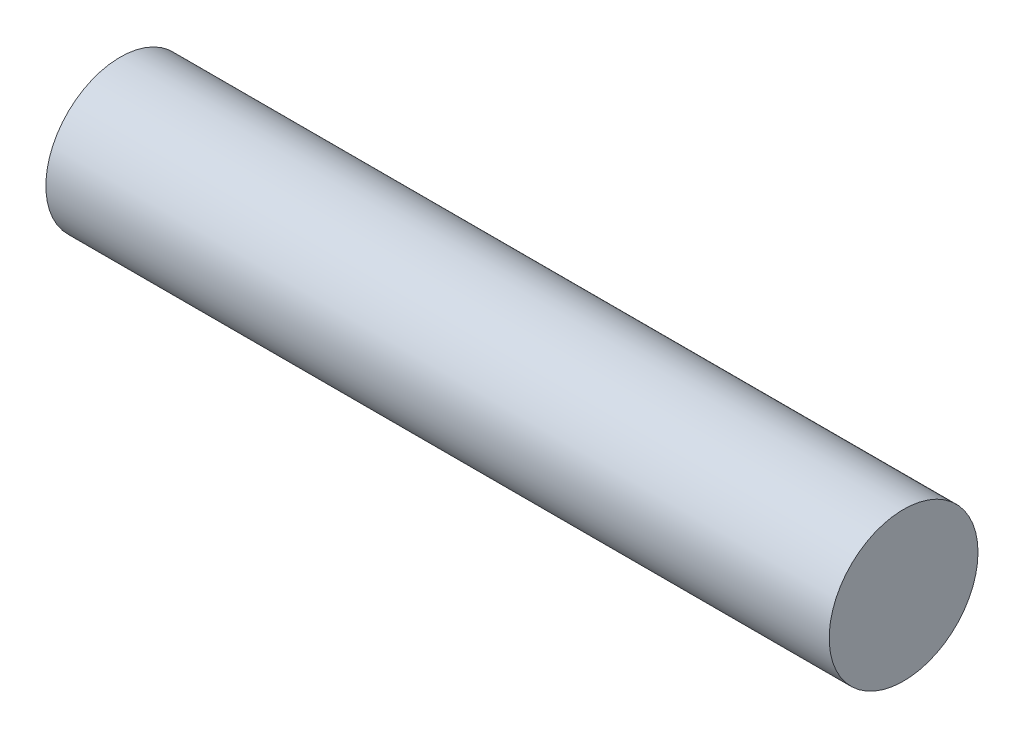
ISO-10303-21;
HEADER;
FILE_DESCRIPTION(('STEP AP214'),'2;1');
FILE_NAME('part.step','',(''),(''),'','','');
FILE_SCHEMA(('AUTOMOTIVE_DESIGN { 1 0 10303 214 1 1 1 1 }'));
ENDSEC;
DATA;
#1=APPLICATION_CONTEXT('core data for automotive mechanical design processes');
#2=APPLICATION_PROTOCOL_DEFINITION('international standard','automotive_design',2000,#1);
#3=PRODUCT_CONTEXT('',#1,'mechanical');
#4=PRODUCT('Part','Part','',(#3));
#5=PRODUCT_RELATED_PRODUCT_CATEGORY('part','',(#4));
#6=PRODUCT_DEFINITION_FORMATION('','',#4);
#7=PRODUCT_DEFINITION_CONTEXT('part definition',#1,'design');
#8=PRODUCT_DEFINITION('design','',#6,#7);
#9=PRODUCT_DEFINITION_SHAPE('','',#8);
#10=(LENGTH_UNIT() NAMED_UNIT(*) SI_UNIT(.MILLI.,.METRE.));
#11=(NAMED_UNIT(*) PLANE_ANGLE_UNIT() SI_UNIT($,.RADIAN.));
#12=(NAMED_UNIT(*) SI_UNIT($,.STERADIAN.) SOLID_ANGLE_UNIT());
#13=UNCERTAINTY_MEASURE_WITH_UNIT(LENGTH_MEASURE(1.E-05),#10,'distance_accuracy_value','');
#14=(GEOMETRIC_REPRESENTATION_CONTEXT(3) GLOBAL_UNCERTAINTY_ASSIGNED_CONTEXT((#13)) GLOBAL_UNIT_ASSIGNED_CONTEXT((#10,
#11,#12)) REPRESENTATION_CONTEXT('',''));
#15=CARTESIAN_POINT('',(0.,0.,0.));
#16=DIRECTION('',(0.,0.,1.));
#17=DIRECTION('',(1.,0.,0.));
#18=AXIS2_PLACEMENT_3D('',#15,#16,#17);
#19=CARTESIAN_POINT('',(10.,0.,0.));
#20=DIRECTION('',(-1.,0.,0.));
#21=DIRECTION('',(0.,0.,1.));
#22=AXIS2_PLACEMENT_3D('',#19,#20,#21);
#23=CYLINDRICAL_SURFACE('',#22,0.95);
#24=CARTESIAN_POINT('',(10.,0.,0.));
#25=DIRECTION('',(1.,0.,0.));
#26=DIRECTION('',(0.,0.,-1.));
#27=AXIS2_PLACEMENT_3D('',#24,#25,#26);
#28=CIRCLE('',#27,0.95);
#29=CARTESIAN_POINT('',(10.,0.,-0.95));
#30=VERTEX_POINT('',#29);
#31=EDGE_CURVE('E10',#30,#30,#28,.T.);
#32=ORIENTED_EDGE('',*,*,#31,.F.);
#33=EDGE_LOOP('',(#32));
#34=FACE_BOUND('',#33,.T.);
#35=CARTESIAN_POINT('',(0.,0.,0.));
#36=DIRECTION('',(1.,0.,0.));
#37=DIRECTION('',(0.,0.,-1.));
#38=AXIS2_PLACEMENT_3D('',#35,#36,#37);
#39=CIRCLE('',#38,0.95);
#40=CARTESIAN_POINT('',(0.,0.,-0.95));
#41=VERTEX_POINT('',#40);
#42=EDGE_CURVE('E33',#41,#41,#39,.T.);
#43=ORIENTED_EDGE('',*,*,#42,.T.);
#44=EDGE_LOOP('',(#43));
#45=FACE_BOUND('',#44,.T.);
#46=ADVANCED_FACE('F30',(#34,#45),#23,.T.);
#47=CARTESIAN_POINT('',(10.,0.,0.));
#48=DIRECTION('',(1.,0.,0.));
#49=DIRECTION('',(0.,0.,-1.));
#50=AXIS2_PLACEMENT_3D('',#47,#48,#49);
#51=PLANE('',#50);
#52=ORIENTED_EDGE('',*,*,#31,.T.);
#53=EDGE_LOOP('',(#52));
#54=FACE_BOUND('',#53,.T.);
#55=ADVANCED_FACE('F45',(#54),#51,.T.);
#56=CARTESIAN_POINT('',(0.,0.,0.));
#57=DIRECTION('',(1.,0.,0.));
#58=DIRECTION('',(0.,0.,-1.));
#59=AXIS2_PLACEMENT_3D('',#56,#57,#58);
#60=PLANE('',#59);
#61=ORIENTED_EDGE('',*,*,#42,.F.);
#62=EDGE_LOOP('',(#61));
#63=FACE_BOUND('',#62,.T.);
#64=ADVANCED_FACE('F43',(#63),#60,.F.);
#65=CLOSED_SHELL('',(#46,#55,#64));
#66=MANIFOLD_SOLID_BREP('B2',#65);
#67=ADVANCED_BREP_SHAPE_REPRESENTATION('',(#18,#66),#14);
#68=SHAPE_DEFINITION_REPRESENTATION(#9,#67);
ENDSEC;
END-ISO-10303-21;
